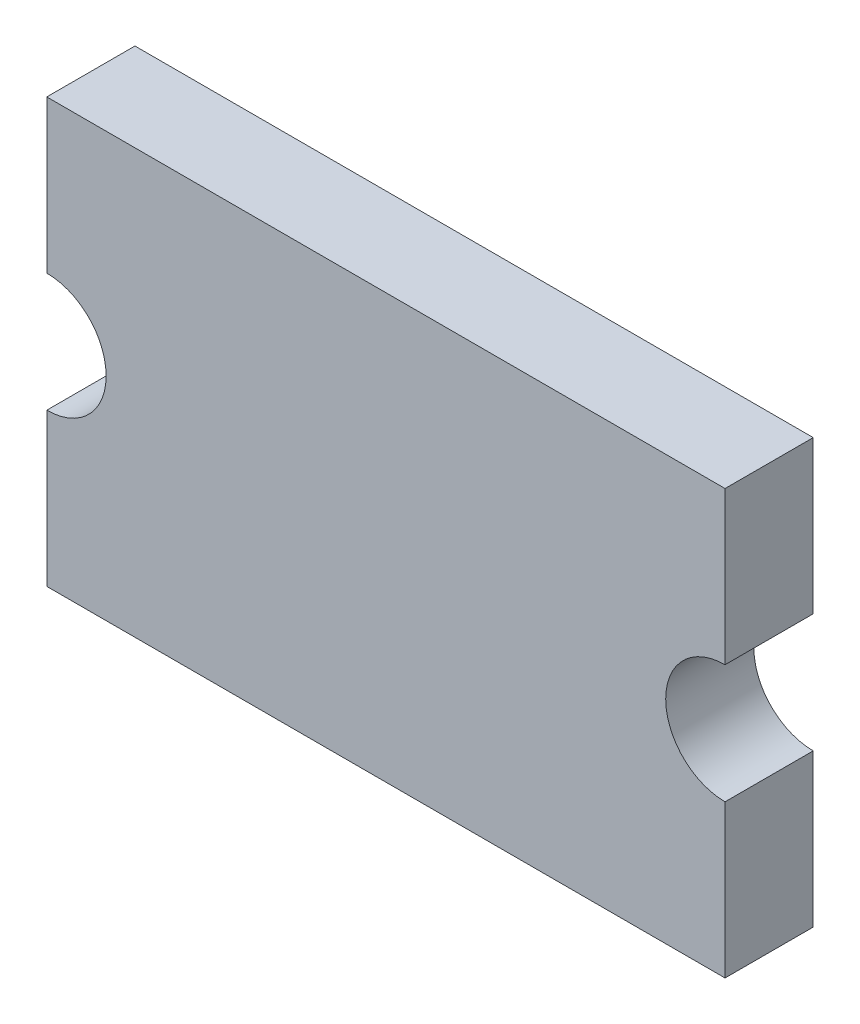
ISO-10303-21;
HEADER;
FILE_DESCRIPTION(('STEP AP214'),'2;1');
FILE_NAME('part.step','',(''),(''),'','','');
FILE_SCHEMA(('AUTOMOTIVE_DESIGN { 1 0 10303 214 1 1 1 1 }'));
ENDSEC;
DATA;
#1=APPLICATION_CONTEXT('core data for automotive mechanical design processes');
#2=APPLICATION_PROTOCOL_DEFINITION('international standard','automotive_design',2000,#1);
#3=PRODUCT_CONTEXT('',#1,'mechanical');
#4=PRODUCT('Part','Part','',(#3));
#5=PRODUCT_RELATED_PRODUCT_CATEGORY('part','',(#4));
#6=PRODUCT_DEFINITION_FORMATION('','',#4);
#7=PRODUCT_DEFINITION_CONTEXT('part definition',#1,'design');
#8=PRODUCT_DEFINITION('design','',#6,#7);
#9=PRODUCT_DEFINITION_SHAPE('','',#8);
#10=(LENGTH_UNIT() NAMED_UNIT(*) SI_UNIT(.MILLI.,.METRE.));
#11=(NAMED_UNIT(*) PLANE_ANGLE_UNIT() SI_UNIT($,.RADIAN.));
#12=(NAMED_UNIT(*) SI_UNIT($,.STERADIAN.) SOLID_ANGLE_UNIT());
#13=UNCERTAINTY_MEASURE_WITH_UNIT(LENGTH_MEASURE(1.E-05),#10,'distance_accuracy_value','');
#14=(GEOMETRIC_REPRESENTATION_CONTEXT(3) GLOBAL_UNCERTAINTY_ASSIGNED_CONTEXT((#13)) GLOBAL_UNIT_ASSIGNED_CONTEXT((#10,
#11,#12)) REPRESENTATION_CONTEXT('',''));
#15=CARTESIAN_POINT('',(0.,0.,0.));
#16=DIRECTION('',(0.,0.,1.));
#17=DIRECTION('',(1.,0.,0.));
#18=AXIS2_PLACEMENT_3D('',#15,#16,#17);
#19=CARTESIAN_POINT('',(0.,0.625,0.28));
#20=DIRECTION('',(0.,1.,0.));
#21=DIRECTION('',(1.,0.,0.));
#22=AXIS2_PLACEMENT_3D('',#19,#20,#21);
#23=PLANE('',#22);
#24=DIRECTION('',(1.,0.,0.));
#25=VECTOR('',#24,1.);
#26=CARTESIAN_POINT('',(0.,0.625,0.02));
#27=LINE('',#26,#25);
#28=CARTESIAN_POINT('',(-1.,0.625,0.02));
#29=VERTEX_POINT('',#28);
#30=CARTESIAN_POINT('',(1.,0.625,0.02));
#31=VERTEX_POINT('',#30);
#32=EDGE_CURVE('E42',#29,#31,#27,.T.);
#33=ORIENTED_EDGE('',*,*,#32,.F.);
#34=DIRECTION('',(0.,0.,-1.));
#35=VECTOR('',#34,1.);
#36=CARTESIAN_POINT('',(-1.,0.625,0.28));
#37=LINE('',#36,#35);
#38=CARTESIAN_POINT('',(-1.,0.625,0.28));
#39=VERTEX_POINT('',#38);
#40=EDGE_CURVE('E154',#39,#29,#37,.T.);
#41=ORIENTED_EDGE('',*,*,#40,.F.);
#42=DIRECTION('',(1.,0.,0.));
#43=VECTOR('',#42,1.);
#44=CARTESIAN_POINT('',(0.,0.625,0.28));
#45=LINE('',#44,#43);
#46=CARTESIAN_POINT('',(1.,0.625,0.28));
#47=VERTEX_POINT('',#46);
#48=EDGE_CURVE('E11',#39,#47,#45,.T.);
#49=ORIENTED_EDGE('',*,*,#48,.T.);
#50=DIRECTION('',(0.,0.,-1.));
#51=VECTOR('',#50,1.);
#52=CARTESIAN_POINT('',(1.,0.625,0.28));
#53=LINE('',#52,#51);
#54=EDGE_CURVE('E28',#47,#31,#53,.T.);
#55=ORIENTED_EDGE('',*,*,#54,.T.);
#56=EDGE_LOOP('',(#33,#41,#49,#55));
#57=FACE_BOUND('',#56,.T.);
#58=ADVANCED_FACE('F17',(#57),#23,.T.);
#59=CARTESIAN_POINT('',(-1.,0.4,0.28));
#60=DIRECTION('',(1.,0.,0.));
#61=DIRECTION('',(0.,1.,0.));
#62=AXIS2_PLACEMENT_3D('',#59,#60,#61);
#63=PLANE('',#62);
#64=DIRECTION('',(0.,-1.,0.));
#65=VECTOR('',#64,1.);
#66=CARTESIAN_POINT('',(-1.,0.4,0.02));
#67=LINE('',#66,#65);
#68=CARTESIAN_POINT('',(-1.,0.175,0.02));
#69=VERTEX_POINT('',#68);
#70=EDGE_CURVE('E143',#29,#69,#67,.T.);
#71=ORIENTED_EDGE('',*,*,#70,.T.);
#72=DIRECTION('',(0.,0.,-1.));
#73=VECTOR('',#72,1.);
#74=CARTESIAN_POINT('',(-1.,0.175,0.28));
#75=LINE('',#74,#73);
#76=CARTESIAN_POINT('',(-1.,0.175,0.28));
#77=VERTEX_POINT('',#76);
#78=EDGE_CURVE('E139',#77,#69,#75,.T.);
#79=ORIENTED_EDGE('',*,*,#78,.F.);
#80=DIRECTION('',(0.,-1.,0.));
#81=VECTOR('',#80,1.);
#82=CARTESIAN_POINT('',(-1.,0.4,0.28));
#83=LINE('',#82,#81);
#84=EDGE_CURVE('E21',#39,#77,#83,.T.);
#85=ORIENTED_EDGE('',*,*,#84,.F.);
#86=ORIENTED_EDGE('',*,*,#40,.T.);
#87=EDGE_LOOP('',(#71,#79,#85,#86));
#88=FACE_BOUND('',#87,.T.);
#89=ADVANCED_FACE('F294',(#88),#63,.F.);
#90=CARTESIAN_POINT('',(-1.,0.,0.28));
#91=DIRECTION('',(0.,0.,-1.));
#92=DIRECTION('',(1.,0.,0.));
#93=AXIS2_PLACEMENT_3D('',#90,#91,#92);
#94=CYLINDRICAL_SURFACE('',#93,0.175);
#95=CARTESIAN_POINT('',(-1.,0.,0.02));
#96=DIRECTION('',(0.,0.,1.));
#97=DIRECTION('',(1.,0.,0.));
#98=AXIS2_PLACEMENT_3D('',#95,#96,#97);
#99=CIRCLE('',#98,0.175);
#100=CARTESIAN_POINT('',(-1.,-0.175,0.02));
#101=VERTEX_POINT('',#100);
#102=EDGE_CURVE('E120',#101,#69,#99,.T.);
#103=ORIENTED_EDGE('',*,*,#102,.F.);
#104=DIRECTION('',(0.,0.,-1.));
#105=VECTOR('',#104,1.);
#106=CARTESIAN_POINT('',(-1.,-0.175,0.28));
#107=LINE('',#106,#105);
#108=CARTESIAN_POINT('',(-1.,-0.175,0.28));
#109=VERTEX_POINT('',#108);
#110=EDGE_CURVE('E112',#109,#101,#107,.T.);
#111=ORIENTED_EDGE('',*,*,#110,.F.);
#112=CARTESIAN_POINT('',(-1.,0.,0.28));
#113=DIRECTION('',(0.,0.,1.));
#114=DIRECTION('',(1.,0.,0.));
#115=AXIS2_PLACEMENT_3D('',#112,#113,#114);
#116=CIRCLE('',#115,0.175);
#117=EDGE_CURVE('E153',#109,#77,#116,.T.);
#118=ORIENTED_EDGE('',*,*,#117,.T.);
#119=ORIENTED_EDGE('',*,*,#78,.T.);
#120=EDGE_LOOP('',(#103,#111,#118,#119));
#121=FACE_BOUND('',#120,.T.);
#122=ADVANCED_FACE('F186',(#121),#94,.F.);
#123=CARTESIAN_POINT('',(-1.,-0.4,0.28));
#124=DIRECTION('',(1.,0.,0.));
#125=DIRECTION('',(0.,1.,0.));
#126=AXIS2_PLACEMENT_3D('',#123,#124,#125);
#127=PLANE('',#126);
#128=DIRECTION('',(0.,-1.,0.));
#129=VECTOR('',#128,1.);
#130=CARTESIAN_POINT('',(-1.,-0.4,0.02));
#131=LINE('',#130,#129);
#132=CARTESIAN_POINT('',(-1.,-0.625,0.02));
#133=VERTEX_POINT('',#132);
#134=EDGE_CURVE('E137',#101,#133,#131,.T.);
#135=ORIENTED_EDGE('',*,*,#134,.T.);
#136=DIRECTION('',(0.,0.,-1.));
#137=VECTOR('',#136,1.);
#138=CARTESIAN_POINT('',(-1.,-0.625,0.28));
#139=LINE('',#138,#137);
#140=CARTESIAN_POINT('',(-1.,-0.625,0.28));
#141=VERTEX_POINT('',#140);
#142=EDGE_CURVE('E107',#141,#133,#139,.T.);
#143=ORIENTED_EDGE('',*,*,#142,.F.);
#144=DIRECTION('',(0.,-1.,0.));
#145=VECTOR('',#144,1.);
#146=CARTESIAN_POINT('',(-1.,-0.4,0.28));
#147=LINE('',#146,#145);
#148=EDGE_CURVE('E134',#109,#141,#147,.T.);
#149=ORIENTED_EDGE('',*,*,#148,.F.);
#150=ORIENTED_EDGE('',*,*,#110,.T.);
#151=EDGE_LOOP('',(#135,#143,#149,#150));
#152=FACE_BOUND('',#151,.T.);
#153=ADVANCED_FACE('F198',(#152),#127,.F.);
#154=CARTESIAN_POINT('',(0.,-0.625,0.28));
#155=DIRECTION('',(0.,1.,0.));
#156=DIRECTION('',(1.,0.,0.));
#157=AXIS2_PLACEMENT_3D('',#154,#155,#156);
#158=PLANE('',#157);
#159=DIRECTION('',(1.,0.,0.));
#160=VECTOR('',#159,1.);
#161=CARTESIAN_POINT('',(0.,-0.625,0.02));
#162=LINE('',#161,#160);
#163=CARTESIAN_POINT('',(1.,-0.625,0.02));
#164=VERTEX_POINT('',#163);
#165=EDGE_CURVE('E104',#133,#164,#162,.T.);
#166=ORIENTED_EDGE('',*,*,#165,.T.);
#167=DIRECTION('',(0.,0.,-1.));
#168=VECTOR('',#167,1.);
#169=CARTESIAN_POINT('',(1.,-0.625,0.28));
#170=LINE('',#169,#168);
#171=CARTESIAN_POINT('',(1.,-0.625,0.28));
#172=VERTEX_POINT('',#171);
#173=EDGE_CURVE('E90',#172,#164,#170,.T.);
#174=ORIENTED_EDGE('',*,*,#173,.F.);
#175=DIRECTION('',(1.,0.,0.));
#176=VECTOR('',#175,1.);
#177=CARTESIAN_POINT('',(0.,-0.625,0.28));
#178=LINE('',#177,#176);
#179=EDGE_CURVE('E133',#141,#172,#178,.T.);
#180=ORIENTED_EDGE('',*,*,#179,.F.);
#181=ORIENTED_EDGE('',*,*,#142,.T.);
#182=EDGE_LOOP('',(#166,#174,#180,#181));
#183=FACE_BOUND('',#182,.T.);
#184=ADVANCED_FACE('F105',(#183),#158,.F.);
#185=CARTESIAN_POINT('',(1.,-0.4,0.28));
#186=DIRECTION('',(1.,0.,0.));
#187=DIRECTION('',(0.,1.,0.));
#188=AXIS2_PLACEMENT_3D('',#185,#186,#187);
#189=PLANE('',#188);
#190=DIRECTION('',(0.,-1.,0.));
#191=VECTOR('',#190,1.);
#192=CARTESIAN_POINT('',(1.,-0.4,0.02));
#193=LINE('',#192,#191);
#194=CARTESIAN_POINT('',(1.,-0.175,0.02));
#195=VERTEX_POINT('',#194);
#196=EDGE_CURVE('E95',#195,#164,#193,.T.);
#197=ORIENTED_EDGE('',*,*,#196,.F.);
#198=DIRECTION('',(0.,0.,-1.));
#199=VECTOR('',#198,1.);
#200=CARTESIAN_POINT('',(1.,-0.175,0.28));
#201=LINE('',#200,#199);
#202=CARTESIAN_POINT('',(1.,-0.175,0.28));
#203=VERTEX_POINT('',#202);
#204=EDGE_CURVE('E146',#203,#195,#201,.T.);
#205=ORIENTED_EDGE('',*,*,#204,.F.);
#206=DIRECTION('',(0.,-1.,0.));
#207=VECTOR('',#206,1.);
#208=CARTESIAN_POINT('',(1.,-0.4,0.28));
#209=LINE('',#208,#207);
#210=EDGE_CURVE('E98',#203,#172,#209,.T.);
#211=ORIENTED_EDGE('',*,*,#210,.T.);
#212=ORIENTED_EDGE('',*,*,#173,.T.);
#213=EDGE_LOOP('',(#197,#205,#211,#212));
#214=FACE_BOUND('',#213,.T.);
#215=ADVANCED_FACE('F92',(#214),#189,.T.);
#216=CARTESIAN_POINT('',(1.,0.,0.28));
#217=DIRECTION('',(0.,0.,-1.));
#218=DIRECTION('',(-1.,0.,0.));
#219=AXIS2_PLACEMENT_3D('',#216,#217,#218);
#220=CYLINDRICAL_SURFACE('',#219,0.175);
#221=CARTESIAN_POINT('',(1.,0.,0.02));
#222=DIRECTION('',(0.,0.,1.));
#223=DIRECTION('',(1.,0.,0.));
#224=AXIS2_PLACEMENT_3D('',#221,#222,#223);
#225=CIRCLE('',#224,0.175);
#226=CARTESIAN_POINT('',(1.,0.175,0.02));
#227=VERTEX_POINT('',#226);
#228=EDGE_CURVE('E118',#227,#195,#225,.T.);
#229=ORIENTED_EDGE('',*,*,#228,.F.);
#230=DIRECTION('',(0.,0.,-1.));
#231=VECTOR('',#230,1.);
#232=CARTESIAN_POINT('',(1.,0.175,0.28));
#233=LINE('',#232,#231);
#234=CARTESIAN_POINT('',(1.,0.175,0.28));
#235=VERTEX_POINT('',#234);
#236=EDGE_CURVE('E159',#235,#227,#233,.T.);
#237=ORIENTED_EDGE('',*,*,#236,.F.);
#238=CARTESIAN_POINT('',(1.,0.,0.28));
#239=DIRECTION('',(0.,0.,1.));
#240=DIRECTION('',(1.,0.,0.));
#241=AXIS2_PLACEMENT_3D('',#238,#239,#240);
#242=CIRCLE('',#241,0.175);
#243=EDGE_CURVE('E102',#235,#203,#242,.T.);
#244=ORIENTED_EDGE('',*,*,#243,.T.);
#245=ORIENTED_EDGE('',*,*,#204,.T.);
#246=EDGE_LOOP('',(#229,#237,#244,#245));
#247=FACE_BOUND('',#246,.T.);
#248=ADVANCED_FACE('F279',(#247),#220,.F.);
#249=CARTESIAN_POINT('',(1.,0.4,0.28));
#250=DIRECTION('',(1.,0.,0.));
#251=DIRECTION('',(0.,1.,0.));
#252=AXIS2_PLACEMENT_3D('',#249,#250,#251);
#253=PLANE('',#252);
#254=DIRECTION('',(0.,-1.,0.));
#255=VECTOR('',#254,1.);
#256=CARTESIAN_POINT('',(1.,0.4,0.02));
#257=LINE('',#256,#255);
#258=EDGE_CURVE('E127',#31,#227,#257,.T.);
#259=ORIENTED_EDGE('',*,*,#258,.F.);
#260=ORIENTED_EDGE('',*,*,#54,.F.);
#261=DIRECTION('',(0.,-1.,0.));
#262=VECTOR('',#261,1.);
#263=CARTESIAN_POINT('',(1.,0.4,0.28));
#264=LINE('',#263,#262);
#265=EDGE_CURVE('E149',#47,#235,#264,.T.);
#266=ORIENTED_EDGE('',*,*,#265,.T.);
#267=ORIENTED_EDGE('',*,*,#236,.T.);
#268=EDGE_LOOP('',(#259,#260,#266,#267));
#269=FACE_BOUND('',#268,.T.);
#270=ADVANCED_FACE('F19',(#269),#253,.T.);
#271=CARTESIAN_POINT('',(0.,0.,0.28));
#272=DIRECTION('',(0.,0.,1.));
#273=DIRECTION('',(1.,0.,0.));
#274=AXIS2_PLACEMENT_3D('',#271,#272,#273);
#275=PLANE('',#274);
#276=ORIENTED_EDGE('',*,*,#48,.F.);
#277=ORIENTED_EDGE('',*,*,#84,.T.);
#278=ORIENTED_EDGE('',*,*,#117,.F.);
#279=ORIENTED_EDGE('',*,*,#148,.T.);
#280=ORIENTED_EDGE('',*,*,#179,.T.);
#281=ORIENTED_EDGE('',*,*,#210,.F.);
#282=ORIENTED_EDGE('',*,*,#243,.F.);
#283=ORIENTED_EDGE('',*,*,#265,.F.);
#284=EDGE_LOOP('',(#276,#277,#278,#279,#280,#281,#282,#283));
#285=FACE_BOUND('',#284,.T.);
#286=ADVANCED_FACE('F193',(#285),#275,.T.);
#287=CARTESIAN_POINT('',(0.,0.,0.02));
#288=DIRECTION('',(0.,0.,1.));
#289=DIRECTION('',(1.,0.,0.));
#290=AXIS2_PLACEMENT_3D('',#287,#288,#289);
#291=PLANE('',#290);
#292=ORIENTED_EDGE('',*,*,#32,.T.);
#293=ORIENTED_EDGE('',*,*,#258,.T.);
#294=ORIENTED_EDGE('',*,*,#228,.T.);
#295=ORIENTED_EDGE('',*,*,#196,.T.);
#296=ORIENTED_EDGE('',*,*,#165,.F.);
#297=ORIENTED_EDGE('',*,*,#134,.F.);
#298=ORIENTED_EDGE('',*,*,#102,.T.);
#299=ORIENTED_EDGE('',*,*,#70,.F.);
#300=EDGE_LOOP('',(#292,#293,#294,#295,#296,#297,#298,#299));
#301=FACE_BOUND('',#300,.T.);
#302=ADVANCED_FACE('F115',(#301),#291,.F.);
#303=CLOSED_SHELL('',(#58,#89,#122,#153,#184,#215,#248,#270,#286,#302));
#304=MANIFOLD_SOLID_BREP('B1',#303);
#305=ADVANCED_BREP_SHAPE_REPRESENTATION('',(#18,#304),#14);
#306=SHAPE_DEFINITION_REPRESENTATION(#9,#305);
ENDSEC;
END-ISO-10303-21;
